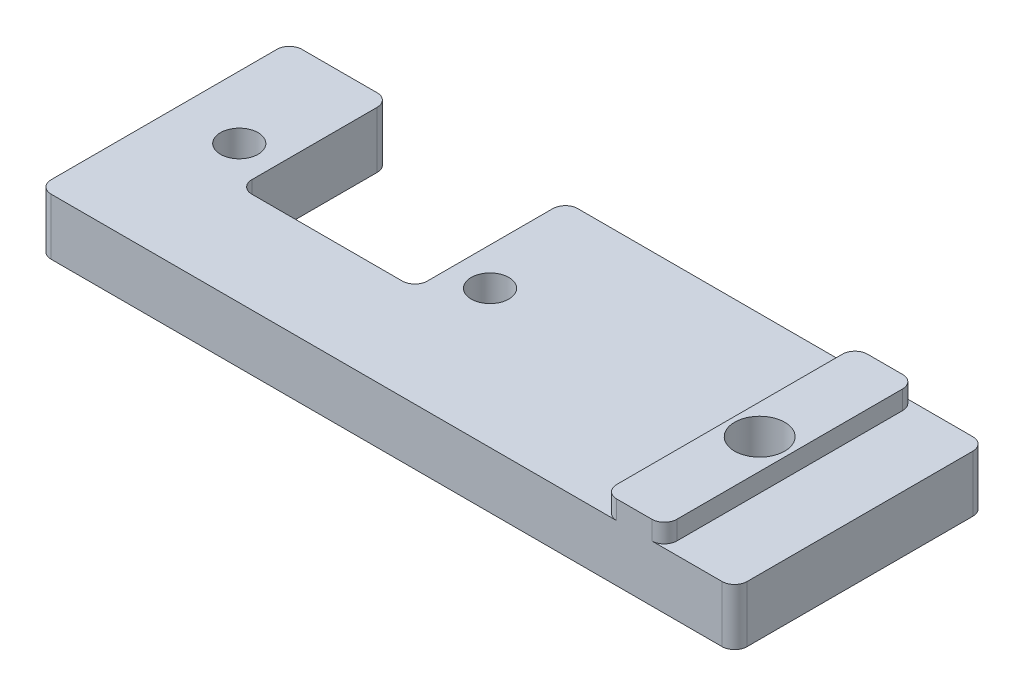
ISO-10303-21;
HEADER;
FILE_DESCRIPTION(('STEP AP214'),'2;1');
FILE_NAME('part.step','',(''),(''),'','','');
FILE_SCHEMA(('AUTOMOTIVE_DESIGN { 1 0 10303 214 1 1 1 1 }'));
ENDSEC;
DATA;
#1=APPLICATION_CONTEXT('core data for automotive mechanical design processes');
#2=APPLICATION_PROTOCOL_DEFINITION('international standard','automotive_design',2000,#1);
#3=PRODUCT_CONTEXT('',#1,'mechanical');
#4=PRODUCT('Part','Part','',(#3));
#5=PRODUCT_RELATED_PRODUCT_CATEGORY('part','',(#4));
#6=PRODUCT_DEFINITION_FORMATION('','',#4);
#7=PRODUCT_DEFINITION_CONTEXT('part definition',#1,'design');
#8=PRODUCT_DEFINITION('design','',#6,#7);
#9=PRODUCT_DEFINITION_SHAPE('','',#8);
#10=(LENGTH_UNIT() NAMED_UNIT(*) SI_UNIT(.MILLI.,.METRE.));
#11=(NAMED_UNIT(*) PLANE_ANGLE_UNIT() SI_UNIT($,.RADIAN.));
#12=(NAMED_UNIT(*) SI_UNIT($,.STERADIAN.) SOLID_ANGLE_UNIT());
#13=UNCERTAINTY_MEASURE_WITH_UNIT(LENGTH_MEASURE(1.E-05),#10,'distance_accuracy_value','');
#14=(GEOMETRIC_REPRESENTATION_CONTEXT(3) GLOBAL_UNCERTAINTY_ASSIGNED_CONTEXT((#13)) GLOBAL_UNIT_ASSIGNED_CONTEXT((#10,
#11,#12)) REPRESENTATION_CONTEXT('',''));
#15=CARTESIAN_POINT('',(0.,0.,0.));
#16=DIRECTION('',(0.,0.,1.));
#17=DIRECTION('',(1.,0.,0.));
#18=AXIS2_PLACEMENT_3D('',#15,#16,#17);
#19=CARTESIAN_POINT('',(0.,0.,0.));
#20=DIRECTION('',(0.,1.,0.));
#21=DIRECTION('',(0.,0.,-1.));
#22=AXIS2_PLACEMENT_3D('',#19,#20,#21);
#23=PLANE('',#22);
#24=CARTESIAN_POINT('',(-10.,0.,0.));
#25=DIRECTION('',(0.,1.,0.));
#26=DIRECTION('',(0.,0.,-1.));
#27=AXIS2_PLACEMENT_3D('',#24,#25,#26);
#28=CIRCLE('',#27,1.5);
#29=CARTESIAN_POINT('',(-10.,0.,-1.5));
#30=VERTEX_POINT('',#29);
#31=EDGE_CURVE('E302',#30,#30,#28,.T.);
#32=ORIENTED_EDGE('',*,*,#31,.T.);
#33=EDGE_LOOP('',(#32));
#34=FACE_BOUND('',#33,.T.);
#35=CARTESIAN_POINT('',(10.,0.,0.));
#36=DIRECTION('',(0.,-1.,0.));
#37=DIRECTION('',(0.,0.,-1.));
#38=AXIS2_PLACEMENT_3D('',#35,#36,#37);
#39=CIRCLE('',#38,1.5);
#40=CARTESIAN_POINT('',(10.,0.,-1.5));
#41=VERTEX_POINT('',#40);
#42=EDGE_CURVE('E357',#41,#41,#39,.T.);
#43=ORIENTED_EDGE('',*,*,#42,.F.);
#44=EDGE_LOOP('',(#43));
#45=FACE_BOUND('',#44,.T.);
#46=DIRECTION('',(-1.,0.,0.));
#47=VECTOR('',#46,1.);
#48=CARTESIAN_POINT('',(15.,0.,11.));
#49=LINE('',#48,#47);
#50=CARTESIAN_POINT('',(39.5,0.,11.));
#51=VERTEX_POINT('',#50);
#52=CARTESIAN_POINT('',(-14.,0.,11.));
#53=VERTEX_POINT('',#52);
#54=EDGE_CURVE('E202',#51,#53,#49,.T.);
#55=ORIENTED_EDGE('',*,*,#54,.T.);
#56=CARTESIAN_POINT('',(-14.,0.,10.));
#57=DIRECTION('',(0.,1.,0.));
#58=DIRECTION('',(0.,0.,-1.));
#59=AXIS2_PLACEMENT_3D('',#56,#57,#58);
#60=CIRCLE('',#59,1.);
#61=CARTESIAN_POINT('',(-15.,0.,10.));
#62=VERTEX_POINT('',#61);
#63=EDGE_CURVE('E212',#53,#62,#60,.F.);
#64=ORIENTED_EDGE('',*,*,#63,.T.);
#65=DIRECTION('',(0.,0.,1.));
#66=VECTOR('',#65,1.);
#67=CARTESIAN_POINT('',(-15.,0.,-9.));
#68=LINE('',#67,#66);
#69=CARTESIAN_POINT('',(-15.,0.,-8.));
#70=VERTEX_POINT('',#69);
#71=EDGE_CURVE('E316',#70,#62,#68,.T.);
#72=ORIENTED_EDGE('',*,*,#71,.F.);
#73=CARTESIAN_POINT('',(-14.,0.,-8.));
#74=DIRECTION('',(0.,1.,0.));
#75=DIRECTION('',(0.,0.,-1.));
#76=AXIS2_PLACEMENT_3D('',#73,#74,#75);
#77=CIRCLE('',#76,1.);
#78=CARTESIAN_POINT('',(-14.,0.,-9.));
#79=VERTEX_POINT('',#78);
#80=EDGE_CURVE('E219',#70,#79,#77,.F.);
#81=ORIENTED_EDGE('',*,*,#80,.T.);
#82=DIRECTION('',(-1.,0.,0.));
#83=VECTOR('',#82,1.);
#84=CARTESIAN_POINT('',(-7.,0.,-9.));
#85=LINE('',#84,#83);
#86=CARTESIAN_POINT('',(-8.,0.,-9.));
#87=VERTEX_POINT('',#86);
#88=EDGE_CURVE('E323',#87,#79,#85,.T.);
#89=ORIENTED_EDGE('',*,*,#88,.F.);
#90=CARTESIAN_POINT('',(-8.,0.,-8.));
#91=DIRECTION('',(0.,1.,0.));
#92=DIRECTION('',(0.,0.,-1.));
#93=AXIS2_PLACEMENT_3D('',#90,#91,#92);
#94=CIRCLE('',#93,1.);
#95=CARTESIAN_POINT('',(-7.,0.,-8.));
#96=VERTEX_POINT('',#95);
#97=EDGE_CURVE('E208',#87,#96,#94,.F.);
#98=ORIENTED_EDGE('',*,*,#97,.T.);
#99=DIRECTION('',(0.,0.,-1.));
#100=VECTOR('',#99,1.);
#101=CARTESIAN_POINT('',(-7.,0.,-9.));
#102=LINE('',#101,#100);
#103=CARTESIAN_POINT('',(-7.,0.,2.));
#104=VERTEX_POINT('',#103);
#105=EDGE_CURVE('E309',#104,#96,#102,.T.);
#106=ORIENTED_EDGE('',*,*,#105,.F.);
#107=CARTESIAN_POINT('',(-6.,0.,2.));
#108=DIRECTION('',(0.,1.,0.));
#109=DIRECTION('',(0.,0.,-1.));
#110=AXIS2_PLACEMENT_3D('',#107,#108,#109);
#111=CIRCLE('',#110,1.);
#112=CARTESIAN_POINT('',(-6.,0.,3.));
#113=VERTEX_POINT('',#112);
#114=EDGE_CURVE('E351',#104,#113,#111,.T.);
#115=ORIENTED_EDGE('',*,*,#114,.T.);
#116=DIRECTION('',(1.,0.,0.));
#117=VECTOR('',#116,1.);
#118=CARTESIAN_POINT('',(7.,0.,3.));
#119=LINE('',#118,#117);
#120=CARTESIAN_POINT('',(6.,0.,3.));
#121=VERTEX_POINT('',#120);
#122=EDGE_CURVE('E225',#113,#121,#119,.T.);
#123=ORIENTED_EDGE('',*,*,#122,.T.);
#124=CARTESIAN_POINT('',(6.,0.,2.));
#125=DIRECTION('',(0.,-1.,0.));
#126=DIRECTION('',(0.,0.,-1.));
#127=AXIS2_PLACEMENT_3D('',#124,#125,#126);
#128=CIRCLE('',#127,1.);
#129=CARTESIAN_POINT('',(7.,0.,2.));
#130=VERTEX_POINT('',#129);
#131=EDGE_CURVE('E251',#130,#121,#128,.T.);
#132=ORIENTED_EDGE('',*,*,#131,.F.);
#133=DIRECTION('',(0.,0.,-1.));
#134=VECTOR('',#133,1.);
#135=CARTESIAN_POINT('',(7.,0.,-9.));
#136=LINE('',#135,#134);
#137=CARTESIAN_POINT('',(7.,0.,-8.));
#138=VERTEX_POINT('',#137);
#139=EDGE_CURVE('E232',#130,#138,#136,.T.);
#140=ORIENTED_EDGE('',*,*,#139,.T.);
#141=CARTESIAN_POINT('',(8.,0.,-8.));
#142=DIRECTION('',(0.,-1.,0.));
#143=DIRECTION('',(0.,0.,-1.));
#144=AXIS2_PLACEMENT_3D('',#141,#142,#143);
#145=CIRCLE('',#144,1.);
#146=CARTESIAN_POINT('',(8.,0.,-9.));
#147=VERTEX_POINT('',#146);
#148=EDGE_CURVE('E236',#147,#138,#145,.F.);
#149=ORIENTED_EDGE('',*,*,#148,.F.);
#150=DIRECTION('',(1.,0.,0.));
#151=VECTOR('',#150,1.);
#152=CARTESIAN_POINT('',(7.,0.,-9.));
#153=LINE('',#152,#151);
#154=CARTESIAN_POINT('',(39.5,0.,-9.));
#155=VERTEX_POINT('',#154);
#156=EDGE_CURVE('E226',#147,#155,#153,.T.);
#157=ORIENTED_EDGE('',*,*,#156,.T.);
#158=CARTESIAN_POINT('',(39.5,0.,-8.));
#159=DIRECTION('',(0.,-1.,0.));
#160=DIRECTION('',(0.,0.,-1.));
#161=AXIS2_PLACEMENT_3D('',#158,#159,#160);
#162=CIRCLE('',#161,1.);
#163=CARTESIAN_POINT('',(40.5,0.,-8.));
#164=VERTEX_POINT('',#163);
#165=EDGE_CURVE('E423',#164,#155,#162,.F.);
#166=ORIENTED_EDGE('',*,*,#165,.F.);
#167=DIRECTION('',(0.,0.,-1.));
#168=VECTOR('',#167,1.);
#169=CARTESIAN_POINT('',(40.5,0.,11.));
#170=LINE('',#169,#168);
#171=CARTESIAN_POINT('',(40.5,0.,10.));
#172=VERTEX_POINT('',#171);
#173=EDGE_CURVE('E300',#172,#164,#170,.T.);
#174=ORIENTED_EDGE('',*,*,#173,.F.);
#175=CARTESIAN_POINT('',(39.5,0.,10.));
#176=DIRECTION('',(0.,-1.,0.));
#177=DIRECTION('',(0.,0.,-1.));
#178=AXIS2_PLACEMENT_3D('',#175,#176,#177);
#179=CIRCLE('',#178,1.);
#180=EDGE_CURVE('E224',#51,#172,#179,.F.);
#181=ORIENTED_EDGE('',*,*,#180,.F.);
#182=EDGE_LOOP('',(#55,#64,#72,#81,#89,#98,#106,#115,#123,#132,#140,#149,#157,#166,#174,#181));
#183=FACE_BOUND('',#182,.T.);
#184=CARTESIAN_POINT('',(32.5,0.,1.));
#185=DIRECTION('',(0.,1.,0.));
#186=DIRECTION('',(0.,0.,1.));
#187=AXIS2_PLACEMENT_3D('',#184,#185,#186);
#188=CIRCLE('',#187,2.);
#189=CARTESIAN_POINT('',(32.5,0.,3.));
#190=VERTEX_POINT('',#189);
#191=EDGE_CURVE('E477',#190,#190,#188,.T.);
#192=ORIENTED_EDGE('',*,*,#191,.T.);
#193=EDGE_LOOP('',(#192));
#194=FACE_BOUND('',#193,.T.);
#195=ADVANCED_FACE('F35',(#34,#45,#183,#194),#23,.F.);
#196=CARTESIAN_POINT('',(0.,4.5,0.));
#197=DIRECTION('',(0.,1.,0.));
#198=DIRECTION('',(0.,0.,-1.));
#199=AXIS2_PLACEMENT_3D('',#196,#197,#198);
#200=PLANE('',#199);
#201=CARTESIAN_POINT('',(-10.,4.5,0.));
#202=DIRECTION('',(0.,1.,0.));
#203=DIRECTION('',(0.,0.,-1.));
#204=AXIS2_PLACEMENT_3D('',#201,#202,#203);
#205=CIRCLE('',#204,1.5);
#206=CARTESIAN_POINT('',(-10.,4.5,-1.5));
#207=VERTEX_POINT('',#206);
#208=EDGE_CURVE('E306',#207,#207,#205,.T.);
#209=ORIENTED_EDGE('',*,*,#208,.F.);
#210=EDGE_LOOP('',(#209));
#211=FACE_BOUND('',#210,.T.);
#212=CARTESIAN_POINT('',(10.,4.5,0.));
#213=DIRECTION('',(0.,-1.,0.));
#214=DIRECTION('',(0.,0.,-1.));
#215=AXIS2_PLACEMENT_3D('',#212,#213,#214);
#216=CIRCLE('',#215,1.5);
#217=CARTESIAN_POINT('',(10.,4.5,-1.5));
#218=VERTEX_POINT('',#217);
#219=EDGE_CURVE('E358',#218,#218,#216,.T.);
#220=ORIENTED_EDGE('',*,*,#219,.T.);
#221=EDGE_LOOP('',(#220));
#222=FACE_BOUND('',#221,.T.);
#223=DIRECTION('',(1.,0.,0.));
#224=VECTOR('',#223,1.);
#225=CARTESIAN_POINT('',(7.,4.5,-9.));
#226=LINE('',#225,#224);
#227=CARTESIAN_POINT('',(8.,4.5,-9.));
#228=VERTEX_POINT('',#227);
#229=CARTESIAN_POINT('',(31.1,4.5,-9.));
#230=VERTEX_POINT('',#229);
#231=EDGE_CURVE('E258',#228,#230,#226,.T.);
#232=ORIENTED_EDGE('',*,*,#231,.F.);
#233=CARTESIAN_POINT('',(8.,4.5,-8.));
#234=DIRECTION('',(0.,-1.,0.));
#235=DIRECTION('',(0.,0.,-1.));
#236=AXIS2_PLACEMENT_3D('',#233,#234,#235);
#237=CIRCLE('',#236,1.);
#238=CARTESIAN_POINT('',(7.,4.5,-8.));
#239=VERTEX_POINT('',#238);
#240=EDGE_CURVE('E239',#239,#228,#237,.T.);
#241=ORIENTED_EDGE('',*,*,#240,.F.);
#242=DIRECTION('',(0.,0.,-1.));
#243=VECTOR('',#242,1.);
#244=CARTESIAN_POINT('',(7.,4.5,-9.));
#245=LINE('',#244,#243);
#246=CARTESIAN_POINT('',(7.,4.5,2.));
#247=VERTEX_POINT('',#246);
#248=EDGE_CURVE('E229',#247,#239,#245,.T.);
#249=ORIENTED_EDGE('',*,*,#248,.F.);
#250=CARTESIAN_POINT('',(6.,4.5,2.));
#251=DIRECTION('',(0.,-1.,0.));
#252=DIRECTION('',(0.,0.,-1.));
#253=AXIS2_PLACEMENT_3D('',#250,#251,#252);
#254=CIRCLE('',#253,1.);
#255=CARTESIAN_POINT('',(6.,4.5,3.));
#256=VERTEX_POINT('',#255);
#257=EDGE_CURVE('E254',#256,#247,#254,.F.);
#258=ORIENTED_EDGE('',*,*,#257,.F.);
#259=DIRECTION('',(1.,0.,0.));
#260=VECTOR('',#259,1.);
#261=CARTESIAN_POINT('',(7.,4.5,3.));
#262=LINE('',#261,#260);
#263=CARTESIAN_POINT('',(-6.,4.5,3.));
#264=VERTEX_POINT('',#263);
#265=EDGE_CURVE('E240',#264,#256,#262,.T.);
#266=ORIENTED_EDGE('',*,*,#265,.F.);
#267=CARTESIAN_POINT('',(-6.,4.5,2.));
#268=DIRECTION('',(0.,1.,0.));
#269=DIRECTION('',(0.,0.,-1.));
#270=AXIS2_PLACEMENT_3D('',#267,#268,#269);
#271=CIRCLE('',#270,1.);
#272=CARTESIAN_POINT('',(-7.,4.5,2.));
#273=VERTEX_POINT('',#272);
#274=EDGE_CURVE('E354',#264,#273,#271,.F.);
#275=ORIENTED_EDGE('',*,*,#274,.T.);
#276=DIRECTION('',(0.,0.,-1.));
#277=VECTOR('',#276,1.);
#278=CARTESIAN_POINT('',(-7.,4.5,-9.));
#279=LINE('',#278,#277);
#280=CARTESIAN_POINT('',(-7.,4.5,-8.));
#281=VERTEX_POINT('',#280);
#282=EDGE_CURVE('E312',#273,#281,#279,.T.);
#283=ORIENTED_EDGE('',*,*,#282,.T.);
#284=CARTESIAN_POINT('',(-8.,4.5,-8.));
#285=DIRECTION('',(0.,1.,0.));
#286=DIRECTION('',(0.,0.,-1.));
#287=AXIS2_PLACEMENT_3D('',#284,#285,#286);
#288=CIRCLE('',#287,1.);
#289=CARTESIAN_POINT('',(-8.,4.5,-9.));
#290=VERTEX_POINT('',#289);
#291=EDGE_CURVE('E333',#281,#290,#288,.T.);
#292=ORIENTED_EDGE('',*,*,#291,.T.);
#293=DIRECTION('',(-1.,0.,0.));
#294=VECTOR('',#293,1.);
#295=CARTESIAN_POINT('',(-7.,4.5,-9.));
#296=LINE('',#295,#294);
#297=CARTESIAN_POINT('',(-14.,4.5,-9.));
#298=VERTEX_POINT('',#297);
#299=EDGE_CURVE('E315',#290,#298,#296,.T.);
#300=ORIENTED_EDGE('',*,*,#299,.T.);
#301=CARTESIAN_POINT('',(-14.,4.5,-8.));
#302=DIRECTION('',(0.,1.,0.));
#303=DIRECTION('',(0.,0.,-1.));
#304=AXIS2_PLACEMENT_3D('',#301,#302,#303);
#305=CIRCLE('',#304,1.);
#306=CARTESIAN_POINT('',(-15.,4.5,-8.));
#307=VERTEX_POINT('',#306);
#308=EDGE_CURVE('E336',#298,#307,#305,.T.);
#309=ORIENTED_EDGE('',*,*,#308,.T.);
#310=DIRECTION('',(0.,0.,1.));
#311=VECTOR('',#310,1.);
#312=CARTESIAN_POINT('',(-15.,4.5,-9.));
#313=LINE('',#312,#311);
#314=CARTESIAN_POINT('',(-15.,4.5,10.));
#315=VERTEX_POINT('',#314);
#316=EDGE_CURVE('E209',#307,#315,#313,.T.);
#317=ORIENTED_EDGE('',*,*,#316,.T.);
#318=CARTESIAN_POINT('',(-14.,4.5,10.));
#319=DIRECTION('',(0.,1.,0.));
#320=DIRECTION('',(0.,0.,-1.));
#321=AXIS2_PLACEMENT_3D('',#318,#319,#320);
#322=CIRCLE('',#321,1.);
#323=CARTESIAN_POINT('',(-14.,4.5,11.));
#324=VERTEX_POINT('',#323);
#325=EDGE_CURVE('E339',#315,#324,#322,.T.);
#326=ORIENTED_EDGE('',*,*,#325,.T.);
#327=DIRECTION('',(-1.,0.,0.));
#328=VECTOR('',#327,1.);
#329=CARTESIAN_POINT('',(15.,4.5,11.));
#330=LINE('',#329,#328);
#331=CARTESIAN_POINT('',(31.1,4.5,11.));
#332=VERTEX_POINT('',#331);
#333=EDGE_CURVE('E204',#332,#324,#330,.T.);
#334=ORIENTED_EDGE('',*,*,#333,.F.);
#335=CARTESIAN_POINT('',(31.1,4.5,10.));
#336=DIRECTION('',(0.,-1.,0.));
#337=DIRECTION('',(0.,0.,-1.));
#338=AXIS2_PLACEMENT_3D('',#335,#336,#337);
#339=CIRCLE('',#338,1.);
#340=CARTESIAN_POINT('',(30.1,4.5,10.));
#341=VERTEX_POINT('',#340);
#342=EDGE_CURVE('E440',#341,#332,#339,.F.);
#343=ORIENTED_EDGE('',*,*,#342,.F.);
#344=DIRECTION('',(0.,0.,1.));
#345=VECTOR('',#344,1.);
#346=CARTESIAN_POINT('',(30.1,4.5,-9.));
#347=LINE('',#346,#345);
#348=CARTESIAN_POINT('',(30.1,4.5,-8.));
#349=VERTEX_POINT('',#348);
#350=EDGE_CURVE('E293',#349,#341,#347,.T.);
#351=ORIENTED_EDGE('',*,*,#350,.F.);
#352=CARTESIAN_POINT('',(31.1,4.5,-8.));
#353=DIRECTION('',(0.,-1.,0.));
#354=DIRECTION('',(0.,0.,-1.));
#355=AXIS2_PLACEMENT_3D('',#352,#353,#354);
#356=CIRCLE('',#355,1.);
#357=EDGE_CURVE('E422',#230,#349,#356,.F.);
#358=ORIENTED_EDGE('',*,*,#357,.F.);
#359=EDGE_LOOP('',(#232,#241,#249,#258,#266,#275,#283,#292,#300,#309,#317,#326,#334,#343,#351,#358));
#360=FACE_BOUND('',#359,.T.);
#361=ADVANCED_FACE('F366',(#211,#222,#360),#200,.T.);
#362=DIRECTION('',(0.,0.,1.));
#363=VECTOR('',#362,1.);
#364=CARTESIAN_POINT('',(40.5,4.5,11.));
#365=LINE('',#364,#363);
#366=CARTESIAN_POINT('',(40.5,4.5,-8.));
#367=VERTEX_POINT('',#366);
#368=CARTESIAN_POINT('',(40.5,4.5,10.));
#369=VERTEX_POINT('',#368);
#370=EDGE_CURVE('E303',#367,#369,#365,.T.);
#371=ORIENTED_EDGE('',*,*,#370,.F.);
#372=CARTESIAN_POINT('',(39.5,4.5,-8.));
#373=DIRECTION('',(0.,-1.,0.));
#374=DIRECTION('',(0.,0.,-1.));
#375=AXIS2_PLACEMENT_3D('',#372,#373,#374);
#376=CIRCLE('',#375,1.);
#377=CARTESIAN_POINT('',(39.5,4.5,-9.));
#378=VERTEX_POINT('',#377);
#379=EDGE_CURVE('E429',#378,#367,#376,.T.);
#380=ORIENTED_EDGE('',*,*,#379,.F.);
#381=CARTESIAN_POINT('',(33.9,4.5,-9.));
#382=VERTEX_POINT('',#381);
#383=EDGE_CURVE('E262',#382,#378,#226,.T.);
#384=ORIENTED_EDGE('',*,*,#383,.F.);
#385=CARTESIAN_POINT('',(33.9,4.5,-8.));
#386=DIRECTION('',(0.,-1.,0.));
#387=DIRECTION('',(0.,0.,-1.));
#388=AXIS2_PLACEMENT_3D('',#385,#386,#387);
#389=CIRCLE('',#388,1.);
#390=CARTESIAN_POINT('',(34.9,4.5,-8.));
#391=VERTEX_POINT('',#390);
#392=EDGE_CURVE('E11',#391,#382,#389,.F.);
#393=ORIENTED_EDGE('',*,*,#392,.F.);
#394=DIRECTION('',(0.,0.,-1.));
#395=VECTOR('',#394,1.);
#396=CARTESIAN_POINT('',(34.9,4.5,-9.));
#397=LINE('',#396,#395);
#398=CARTESIAN_POINT('',(34.9,4.5,10.));
#399=VERTEX_POINT('',#398);
#400=EDGE_CURVE('E288',#399,#391,#397,.T.);
#401=ORIENTED_EDGE('',*,*,#400,.F.);
#402=CARTESIAN_POINT('',(33.9,4.5,10.));
#403=DIRECTION('',(0.,-1.,0.));
#404=DIRECTION('',(0.,0.,-1.));
#405=AXIS2_PLACEMENT_3D('',#402,#403,#404);
#406=CIRCLE('',#405,1.);
#407=CARTESIAN_POINT('',(33.9,4.5,11.));
#408=VERTEX_POINT('',#407);
#409=EDGE_CURVE('E43',#408,#399,#406,.F.);
#410=ORIENTED_EDGE('',*,*,#409,.F.);
#411=CARTESIAN_POINT('',(39.5,4.5,11.));
#412=VERTEX_POINT('',#411);
#413=EDGE_CURVE('E274',#412,#408,#330,.T.);
#414=ORIENTED_EDGE('',*,*,#413,.F.);
#415=CARTESIAN_POINT('',(39.5,4.5,10.));
#416=DIRECTION('',(0.,-1.,0.));
#417=DIRECTION('',(0.,0.,-1.));
#418=AXIS2_PLACEMENT_3D('',#415,#416,#417);
#419=CIRCLE('',#418,1.);
#420=EDGE_CURVE('E431',#369,#412,#419,.T.);
#421=ORIENTED_EDGE('',*,*,#420,.F.);
#422=EDGE_LOOP('',(#371,#380,#384,#393,#401,#410,#414,#421));
#423=FACE_BOUND('',#422,.T.);
#424=ADVANCED_FACE('F372',(#423),#200,.T.);
#425=CARTESIAN_POINT('',(7.,4.5,-9.));
#426=DIRECTION('',(1.,0.,0.));
#427=DIRECTION('',(0.,0.,1.));
#428=AXIS2_PLACEMENT_3D('',#425,#426,#427);
#429=PLANE('',#428);
#430=ORIENTED_EDGE('',*,*,#139,.F.);
#431=DIRECTION('',(0.,-1.,0.));
#432=VECTOR('',#431,1.);
#433=CARTESIAN_POINT('',(7.,0.,2.));
#434=LINE('',#433,#432);
#435=EDGE_CURVE('E245',#247,#130,#434,.T.);
#436=ORIENTED_EDGE('',*,*,#435,.F.);
#437=ORIENTED_EDGE('',*,*,#248,.T.);
#438=DIRECTION('',(0.,-1.,0.));
#439=VECTOR('',#438,1.);
#440=CARTESIAN_POINT('',(7.,4.5,-8.));
#441=LINE('',#440,#439);
#442=EDGE_CURVE('E247',#138,#239,#441,.F.);
#443=ORIENTED_EDGE('',*,*,#442,.F.);
#444=EDGE_LOOP('',(#430,#436,#437,#443));
#445=FACE_BOUND('',#444,.T.);
#446=ADVANCED_FACE('F386',(#445),#429,.F.);
#447=CARTESIAN_POINT('',(7.,4.5,-9.));
#448=DIRECTION('',(0.,0.,1.));
#449=DIRECTION('',(-1.,0.,0.));
#450=AXIS2_PLACEMENT_3D('',#447,#448,#449);
#451=PLANE('',#450);
#452=DIRECTION('',(-1.,0.,0.));
#453=VECTOR('',#452,1.);
#454=CARTESIAN_POINT('',(30.1,6.,-9.));
#455=LINE('',#454,#453);
#456=CARTESIAN_POINT('',(33.9,6.,-9.));
#457=VERTEX_POINT('',#456);
#458=CARTESIAN_POINT('',(31.1,6.,-9.));
#459=VERTEX_POINT('',#458);
#460=EDGE_CURVE('E305',#457,#459,#455,.T.);
#461=ORIENTED_EDGE('',*,*,#460,.F.);
#462=DIRECTION('',(0.,-1.,0.));
#463=VECTOR('',#462,1.);
#464=CARTESIAN_POINT('',(33.9,6.,-9.));
#465=LINE('',#464,#463);
#466=EDGE_CURVE('E459',#382,#457,#465,.F.);
#467=ORIENTED_EDGE('',*,*,#466,.F.);
#468=ORIENTED_EDGE('',*,*,#383,.T.);
#469=DIRECTION('',(0.,1.,0.));
#470=VECTOR('',#469,1.);
#471=CARTESIAN_POINT('',(39.5,4.5,-9.));
#472=LINE('',#471,#470);
#473=EDGE_CURVE('E257',#155,#378,#472,.T.);
#474=ORIENTED_EDGE('',*,*,#473,.F.);
#475=ORIENTED_EDGE('',*,*,#156,.F.);
#476=DIRECTION('',(0.,-1.,0.));
#477=VECTOR('',#476,1.);
#478=CARTESIAN_POINT('',(8.,4.5,-9.));
#479=LINE('',#478,#477);
#480=EDGE_CURVE('E243',#228,#147,#479,.T.);
#481=ORIENTED_EDGE('',*,*,#480,.F.);
#482=ORIENTED_EDGE('',*,*,#231,.T.);
#483=DIRECTION('',(0.,-1.,0.));
#484=VECTOR('',#483,1.);
#485=CARTESIAN_POINT('',(31.1,4.5,-9.));
#486=LINE('',#485,#484);
#487=EDGE_CURVE('E539',#459,#230,#486,.T.);
#488=ORIENTED_EDGE('',*,*,#487,.F.);
#489=EDGE_LOOP('',(#461,#467,#468,#474,#475,#481,#482,#488));
#490=FACE_BOUND('',#489,.T.);
#491=ADVANCED_FACE('F383',(#490),#451,.F.);
#492=CARTESIAN_POINT('',(15.,4.5,11.));
#493=DIRECTION('',(0.,0.,-1.));
#494=DIRECTION('',(1.,0.,0.));
#495=AXIS2_PLACEMENT_3D('',#492,#493,#494);
#496=PLANE('',#495);
#497=ORIENTED_EDGE('',*,*,#333,.T.);
#498=DIRECTION('',(0.,-1.,0.));
#499=VECTOR('',#498,1.);
#500=CARTESIAN_POINT('',(-14.,4.5,11.));
#501=LINE('',#500,#499);
#502=EDGE_CURVE('E198',#324,#53,#501,.T.);
#503=ORIENTED_EDGE('',*,*,#502,.T.);
#504=ORIENTED_EDGE('',*,*,#54,.F.);
#505=DIRECTION('',(0.,1.,0.));
#506=VECTOR('',#505,1.);
#507=CARTESIAN_POINT('',(39.5,0.,11.));
#508=LINE('',#507,#506);
#509=EDGE_CURVE('E280',#412,#51,#508,.F.);
#510=ORIENTED_EDGE('',*,*,#509,.F.);
#511=ORIENTED_EDGE('',*,*,#413,.T.);
#512=DIRECTION('',(0.,-1.,0.));
#513=VECTOR('',#512,1.);
#514=CARTESIAN_POINT('',(33.9,4.5,11.));
#515=LINE('',#514,#513);
#516=CARTESIAN_POINT('',(33.9,6.,11.));
#517=VERTEX_POINT('',#516);
#518=EDGE_CURVE('E282',#517,#408,#515,.T.);
#519=ORIENTED_EDGE('',*,*,#518,.F.);
#520=DIRECTION('',(1.,0.,0.));
#521=VECTOR('',#520,1.);
#522=CARTESIAN_POINT('',(30.1,6.,11.));
#523=LINE('',#522,#521);
#524=CARTESIAN_POINT('',(31.1,6.,11.));
#525=VERTEX_POINT('',#524);
#526=EDGE_CURVE('E469',#525,#517,#523,.T.);
#527=ORIENTED_EDGE('',*,*,#526,.F.);
#528=DIRECTION('',(0.,-1.,0.));
#529=VECTOR('',#528,1.);
#530=CARTESIAN_POINT('',(31.1,6.,11.));
#531=LINE('',#530,#529);
#532=EDGE_CURVE('E284',#332,#525,#531,.F.);
#533=ORIENTED_EDGE('',*,*,#532,.F.);
#534=EDGE_LOOP('',(#497,#503,#504,#510,#511,#519,#527,#533));
#535=FACE_BOUND('',#534,.T.);
#536=ADVANCED_FACE('F200',(#535),#496,.F.);
#537=CARTESIAN_POINT('',(7.,4.5,3.));
#538=DIRECTION('',(0.,0.,1.));
#539=DIRECTION('',(-1.,0.,0.));
#540=AXIS2_PLACEMENT_3D('',#537,#538,#539);
#541=PLANE('',#540);
#542=ORIENTED_EDGE('',*,*,#122,.F.);
#543=DIRECTION('',(0.,-1.,0.));
#544=VECTOR('',#543,1.);
#545=CARTESIAN_POINT('',(-6.,4.5,3.));
#546=LINE('',#545,#544);
#547=EDGE_CURVE('E349',#113,#264,#546,.F.);
#548=ORIENTED_EDGE('',*,*,#547,.T.);
#549=ORIENTED_EDGE('',*,*,#265,.T.);
#550=DIRECTION('',(0.,-1.,0.));
#551=VECTOR('',#550,1.);
#552=CARTESIAN_POINT('',(6.,4.5,3.));
#553=LINE('',#552,#551);
#554=EDGE_CURVE('E249',#121,#256,#553,.F.);
#555=ORIENTED_EDGE('',*,*,#554,.F.);
#556=EDGE_LOOP('',(#542,#548,#549,#555));
#557=FACE_BOUND('',#556,.T.);
#558=ADVANCED_FACE('F377',(#557),#541,.F.);
#559=CARTESIAN_POINT('',(10.,4.5,0.));
#560=DIRECTION('',(0.,-1.,0.));
#561=DIRECTION('',(0.,0.,1.));
#562=AXIS2_PLACEMENT_3D('',#559,#560,#561);
#563=CYLINDRICAL_SURFACE('',#562,1.5);
#564=ORIENTED_EDGE('',*,*,#219,.F.);
#565=EDGE_LOOP('',(#564));
#566=FACE_BOUND('',#565,.T.);
#567=ORIENTED_EDGE('',*,*,#42,.T.);
#568=EDGE_LOOP('',(#567));
#569=FACE_BOUND('',#568,.T.);
#570=ADVANCED_FACE('F363',(#566,#569),#563,.F.);
#571=CARTESIAN_POINT('',(8.,4.5,-8.));
#572=DIRECTION('',(0.,-1.,0.));
#573=DIRECTION('',(0.,0.,1.));
#574=AXIS2_PLACEMENT_3D('',#571,#572,#573);
#575=CYLINDRICAL_SURFACE('',#574,1.);
#576=ORIENTED_EDGE('',*,*,#240,.T.);
#577=ORIENTED_EDGE('',*,*,#480,.T.);
#578=ORIENTED_EDGE('',*,*,#148,.T.);
#579=ORIENTED_EDGE('',*,*,#442,.T.);
#580=EDGE_LOOP('',(#576,#577,#578,#579));
#581=FACE_BOUND('',#580,.T.);
#582=ADVANCED_FACE('F391',(#581),#575,.T.);
#583=CARTESIAN_POINT('',(6.,4.5,2.));
#584=DIRECTION('',(0.,1.,0.));
#585=DIRECTION('',(0.,0.,-1.));
#586=AXIS2_PLACEMENT_3D('',#583,#584,#585);
#587=CYLINDRICAL_SURFACE('',#586,1.);
#588=ORIENTED_EDGE('',*,*,#257,.T.);
#589=ORIENTED_EDGE('',*,*,#435,.T.);
#590=ORIENTED_EDGE('',*,*,#131,.T.);
#591=ORIENTED_EDGE('',*,*,#554,.T.);
#592=EDGE_LOOP('',(#588,#589,#590,#591));
#593=FACE_BOUND('',#592,.T.);
#594=ADVANCED_FACE('F394',(#593),#587,.F.);
#595=CARTESIAN_POINT('',(-7.,4.5,-9.));
#596=DIRECTION('',(-1.,0.,0.));
#597=DIRECTION('',(0.,0.,1.));
#598=AXIS2_PLACEMENT_3D('',#595,#596,#597);
#599=PLANE('',#598);
#600=ORIENTED_EDGE('',*,*,#105,.T.);
#601=DIRECTION('',(0.,-1.,0.));
#602=VECTOR('',#601,1.);
#603=CARTESIAN_POINT('',(-7.,4.5,-8.));
#604=LINE('',#603,#602);
#605=EDGE_CURVE('E347',#96,#281,#604,.F.);
#606=ORIENTED_EDGE('',*,*,#605,.T.);
#607=ORIENTED_EDGE('',*,*,#282,.F.);
#608=DIRECTION('',(0.,-1.,0.));
#609=VECTOR('',#608,1.);
#610=CARTESIAN_POINT('',(-7.,0.,2.));
#611=LINE('',#610,#609);
#612=EDGE_CURVE('E345',#273,#104,#611,.T.);
#613=ORIENTED_EDGE('',*,*,#612,.T.);
#614=EDGE_LOOP('',(#600,#606,#607,#613));
#615=FACE_BOUND('',#614,.T.);
#616=ADVANCED_FACE('F398',(#615),#599,.F.);
#617=CARTESIAN_POINT('',(-7.,4.5,-9.));
#618=DIRECTION('',(0.,0.,1.));
#619=DIRECTION('',(1.,0.,0.));
#620=AXIS2_PLACEMENT_3D('',#617,#618,#619);
#621=PLANE('',#620);
#622=ORIENTED_EDGE('',*,*,#88,.T.);
#623=DIRECTION('',(0.,-1.,0.));
#624=VECTOR('',#623,1.);
#625=CARTESIAN_POINT('',(-14.,4.5,-9.));
#626=LINE('',#625,#624);
#627=EDGE_CURVE('E343',#79,#298,#626,.F.);
#628=ORIENTED_EDGE('',*,*,#627,.T.);
#629=ORIENTED_EDGE('',*,*,#299,.F.);
#630=DIRECTION('',(0.,-1.,0.));
#631=VECTOR('',#630,1.);
#632=CARTESIAN_POINT('',(-8.,4.5,-9.));
#633=LINE('',#632,#631);
#634=EDGE_CURVE('E341',#290,#87,#633,.T.);
#635=ORIENTED_EDGE('',*,*,#634,.T.);
#636=EDGE_LOOP('',(#622,#628,#629,#635));
#637=FACE_BOUND('',#636,.T.);
#638=ADVANCED_FACE('F506',(#637),#621,.F.);
#639=CARTESIAN_POINT('',(-15.,4.5,-9.));
#640=DIRECTION('',(1.,0.,0.));
#641=DIRECTION('',(0.,0.,-1.));
#642=AXIS2_PLACEMENT_3D('',#639,#640,#641);
#643=PLANE('',#642);
#644=ORIENTED_EDGE('',*,*,#71,.T.);
#645=DIRECTION('',(0.,-1.,0.));
#646=VECTOR('',#645,1.);
#647=CARTESIAN_POINT('',(-15.,4.5,10.));
#648=LINE('',#647,#646);
#649=EDGE_CURVE('E214',#62,#315,#648,.F.);
#650=ORIENTED_EDGE('',*,*,#649,.T.);
#651=ORIENTED_EDGE('',*,*,#316,.F.);
#652=DIRECTION('',(0.,-1.,0.));
#653=VECTOR('',#652,1.);
#654=CARTESIAN_POINT('',(-15.,4.5,-8.));
#655=LINE('',#654,#653);
#656=EDGE_CURVE('E218',#307,#70,#655,.T.);
#657=ORIENTED_EDGE('',*,*,#656,.T.);
#658=EDGE_LOOP('',(#644,#650,#651,#657));
#659=FACE_BOUND('',#658,.T.);
#660=ADVANCED_FACE('F502',(#659),#643,.F.);
#661=CARTESIAN_POINT('',(-10.,4.5,0.));
#662=DIRECTION('',(0.,-1.,0.));
#663=DIRECTION('',(0.,0.,1.));
#664=AXIS2_PLACEMENT_3D('',#661,#662,#663);
#665=CYLINDRICAL_SURFACE('',#664,1.5);
#666=ORIENTED_EDGE('',*,*,#208,.T.);
#667=EDGE_LOOP('',(#666));
#668=FACE_BOUND('',#667,.T.);
#669=ORIENTED_EDGE('',*,*,#31,.F.);
#670=EDGE_LOOP('',(#669));
#671=FACE_BOUND('',#670,.T.);
#672=ADVANCED_FACE('F499',(#668,#671),#665,.F.);
#673=CARTESIAN_POINT('',(-14.,4.5,10.));
#674=DIRECTION('',(0.,-1.,0.));
#675=DIRECTION('',(0.,0.,1.));
#676=AXIS2_PLACEMENT_3D('',#673,#674,#675);
#677=CYLINDRICAL_SURFACE('',#676,1.);
#678=ORIENTED_EDGE('',*,*,#325,.F.);
#679=ORIENTED_EDGE('',*,*,#649,.F.);
#680=ORIENTED_EDGE('',*,*,#63,.F.);
#681=ORIENTED_EDGE('',*,*,#502,.F.);
#682=EDGE_LOOP('',(#678,#679,#680,#681));
#683=FACE_BOUND('',#682,.T.);
#684=ADVANCED_FACE('F213',(#683),#677,.T.);
#685=CARTESIAN_POINT('',(-14.,4.5,-8.));
#686=DIRECTION('',(0.,-1.,0.));
#687=DIRECTION('',(0.,0.,1.));
#688=AXIS2_PLACEMENT_3D('',#685,#686,#687);
#689=CYLINDRICAL_SURFACE('',#688,1.);
#690=ORIENTED_EDGE('',*,*,#308,.F.);
#691=ORIENTED_EDGE('',*,*,#627,.F.);
#692=ORIENTED_EDGE('',*,*,#80,.F.);
#693=ORIENTED_EDGE('',*,*,#656,.F.);
#694=EDGE_LOOP('',(#690,#691,#692,#693));
#695=FACE_BOUND('',#694,.T.);
#696=ADVANCED_FACE('F516',(#695),#689,.T.);
#697=CARTESIAN_POINT('',(-8.,4.5,-8.));
#698=DIRECTION('',(0.,-1.,0.));
#699=DIRECTION('',(0.,0.,1.));
#700=AXIS2_PLACEMENT_3D('',#697,#698,#699);
#701=CYLINDRICAL_SURFACE('',#700,1.);
#702=ORIENTED_EDGE('',*,*,#291,.F.);
#703=ORIENTED_EDGE('',*,*,#605,.F.);
#704=ORIENTED_EDGE('',*,*,#97,.F.);
#705=ORIENTED_EDGE('',*,*,#634,.F.);
#706=EDGE_LOOP('',(#702,#703,#704,#705));
#707=FACE_BOUND('',#706,.T.);
#708=ADVANCED_FACE('F519',(#707),#701,.T.);
#709=CARTESIAN_POINT('',(-6.,4.5,2.));
#710=DIRECTION('',(0.,1.,0.));
#711=DIRECTION('',(0.,0.,-1.));
#712=AXIS2_PLACEMENT_3D('',#709,#710,#711);
#713=CYLINDRICAL_SURFACE('',#712,1.);
#714=ORIENTED_EDGE('',*,*,#274,.F.);
#715=ORIENTED_EDGE('',*,*,#547,.F.);
#716=ORIENTED_EDGE('',*,*,#114,.F.);
#717=ORIENTED_EDGE('',*,*,#612,.F.);
#718=EDGE_LOOP('',(#714,#715,#716,#717));
#719=FACE_BOUND('',#718,.T.);
#720=ADVANCED_FACE('F498',(#719),#713,.F.);
#721=CARTESIAN_POINT('',(40.5,-33.2001506020681,11.));
#722=DIRECTION('',(1.,0.,0.));
#723=DIRECTION('',(0.,0.,1.));
#724=AXIS2_PLACEMENT_3D('',#721,#722,#723);
#725=PLANE('',#724);
#726=ORIENTED_EDGE('',*,*,#173,.T.);
#727=DIRECTION('',(0.,1.,0.));
#728=VECTOR('',#727,1.);
#729=CARTESIAN_POINT('',(40.5,0.,-8.));
#730=LINE('',#729,#728);
#731=EDGE_CURVE('E58',#367,#164,#730,.F.);
#732=ORIENTED_EDGE('',*,*,#731,.F.);
#733=ORIENTED_EDGE('',*,*,#370,.T.);
#734=DIRECTION('',(0.,1.,0.));
#735=VECTOR('',#734,1.);
#736=CARTESIAN_POINT('',(40.5,4.5,10.));
#737=LINE('',#736,#735);
#738=EDGE_CURVE('E50',#172,#369,#737,.T.);
#739=ORIENTED_EDGE('',*,*,#738,.F.);
#740=EDGE_LOOP('',(#726,#732,#733,#739));
#741=FACE_BOUND('',#740,.T.);
#742=ADVANCED_FACE('F427',(#741),#725,.T.);
#743=CARTESIAN_POINT('',(30.1,6.,-9.));
#744=DIRECTION('',(-1.,0.,0.));
#745=DIRECTION('',(0.,0.,-1.));
#746=AXIS2_PLACEMENT_3D('',#743,#744,#745);
#747=PLANE('',#746);
#748=ORIENTED_EDGE('',*,*,#350,.T.);
#749=DIRECTION('',(0.,-1.,0.));
#750=VECTOR('',#749,1.);
#751=CARTESIAN_POINT('',(30.1,4.5,10.));
#752=LINE('',#751,#750);
#753=CARTESIAN_POINT('',(30.1,6.,10.));
#754=VERTEX_POINT('',#753);
#755=EDGE_CURVE('E551',#754,#341,#752,.T.);
#756=ORIENTED_EDGE('',*,*,#755,.F.);
#757=DIRECTION('',(0.,0.,1.));
#758=VECTOR('',#757,1.);
#759=CARTESIAN_POINT('',(30.1,6.,-9.));
#760=LINE('',#759,#758);
#761=CARTESIAN_POINT('',(30.1,6.,-8.));
#762=VERTEX_POINT('',#761);
#763=EDGE_CURVE('E292',#762,#754,#760,.T.);
#764=ORIENTED_EDGE('',*,*,#763,.F.);
#765=DIRECTION('',(0.,-1.,0.));
#766=VECTOR('',#765,1.);
#767=CARTESIAN_POINT('',(30.1,6.,-8.));
#768=LINE('',#767,#766);
#769=EDGE_CURVE('E464',#349,#762,#768,.F.);
#770=ORIENTED_EDGE('',*,*,#769,.F.);
#771=EDGE_LOOP('',(#748,#756,#764,#770));
#772=FACE_BOUND('',#771,.T.);
#773=ADVANCED_FACE('F492',(#772),#747,.T.);
#774=CARTESIAN_POINT('',(34.9,6.,-9.));
#775=DIRECTION('',(1.,0.,0.));
#776=DIRECTION('',(0.,0.,1.));
#777=AXIS2_PLACEMENT_3D('',#774,#775,#776);
#778=PLANE('',#777);
#779=ORIENTED_EDGE('',*,*,#400,.T.);
#780=DIRECTION('',(0.,-1.,0.));
#781=VECTOR('',#780,1.);
#782=CARTESIAN_POINT('',(34.9,4.5,-8.));
#783=LINE('',#782,#781);
#784=CARTESIAN_POINT('',(34.9,6.,-8.));
#785=VERTEX_POINT('',#784);
#786=EDGE_CURVE('E287',#785,#391,#783,.T.);
#787=ORIENTED_EDGE('',*,*,#786,.F.);
#788=DIRECTION('',(0.,0.,-1.));
#789=VECTOR('',#788,1.);
#790=CARTESIAN_POINT('',(34.9,6.,-9.));
#791=LINE('',#790,#789);
#792=CARTESIAN_POINT('',(34.9,6.,10.));
#793=VERTEX_POINT('',#792);
#794=EDGE_CURVE('E456',#793,#785,#791,.T.);
#795=ORIENTED_EDGE('',*,*,#794,.F.);
#796=DIRECTION('',(0.,-1.,0.));
#797=VECTOR('',#796,1.);
#798=CARTESIAN_POINT('',(34.9,6.,10.));
#799=LINE('',#798,#797);
#800=EDGE_CURVE('E433',#399,#793,#799,.F.);
#801=ORIENTED_EDGE('',*,*,#800,.F.);
#802=EDGE_LOOP('',(#779,#787,#795,#801));
#803=FACE_BOUND('',#802,.T.);
#804=ADVANCED_FACE('F454',(#803),#778,.T.);
#805=CARTESIAN_POINT('',(0.,6.,0.));
#806=DIRECTION('',(0.,-1.,0.));
#807=DIRECTION('',(0.,0.,1.));
#808=AXIS2_PLACEMENT_3D('',#805,#806,#807);
#809=PLANE('',#808);
#810=CARTESIAN_POINT('',(32.5,6.,1.));
#811=DIRECTION('',(0.,1.,0.));
#812=DIRECTION('',(0.,0.,1.));
#813=AXIS2_PLACEMENT_3D('',#810,#811,#812);
#814=CIRCLE('',#813,2.);
#815=CARTESIAN_POINT('',(32.5,6.,3.));
#816=VERTEX_POINT('',#815);
#817=EDGE_CURVE('E474',#816,#816,#814,.T.);
#818=ORIENTED_EDGE('',*,*,#817,.F.);
#819=EDGE_LOOP('',(#818));
#820=FACE_BOUND('',#819,.T.);
#821=ORIENTED_EDGE('',*,*,#763,.T.);
#822=CARTESIAN_POINT('',(31.1,6.,10.));
#823=DIRECTION('',(0.,1.,0.));
#824=DIRECTION('',(0.,0.,1.));
#825=AXIS2_PLACEMENT_3D('',#822,#823,#824);
#826=CIRCLE('',#825,1.);
#827=EDGE_CURVE('E557',#525,#754,#826,.F.);
#828=ORIENTED_EDGE('',*,*,#827,.F.);
#829=ORIENTED_EDGE('',*,*,#526,.T.);
#830=CARTESIAN_POINT('',(33.9,6.,10.));
#831=DIRECTION('',(0.,1.,0.));
#832=DIRECTION('',(0.,0.,1.));
#833=AXIS2_PLACEMENT_3D('',#830,#831,#832);
#834=CIRCLE('',#833,1.);
#835=EDGE_CURVE('E463',#793,#517,#834,.F.);
#836=ORIENTED_EDGE('',*,*,#835,.F.);
#837=ORIENTED_EDGE('',*,*,#794,.T.);
#838=CARTESIAN_POINT('',(33.9,6.,-8.));
#839=DIRECTION('',(0.,1.,0.));
#840=DIRECTION('',(0.,0.,1.));
#841=AXIS2_PLACEMENT_3D('',#838,#839,#840);
#842=CIRCLE('',#841,1.);
#843=EDGE_CURVE('E458',#457,#785,#842,.F.);
#844=ORIENTED_EDGE('',*,*,#843,.F.);
#845=ORIENTED_EDGE('',*,*,#460,.T.);
#846=CARTESIAN_POINT('',(31.1,6.,-8.));
#847=DIRECTION('',(0.,1.,0.));
#848=DIRECTION('',(0.,0.,1.));
#849=AXIS2_PLACEMENT_3D('',#846,#847,#848);
#850=CIRCLE('',#849,1.);
#851=EDGE_CURVE('E278',#762,#459,#850,.F.);
#852=ORIENTED_EDGE('',*,*,#851,.F.);
#853=EDGE_LOOP('',(#821,#828,#829,#836,#837,#844,#845,#852));
#854=FACE_BOUND('',#853,.T.);
#855=ADVANCED_FACE('F467',(#820,#854),#809,.F.);
#856=CARTESIAN_POINT('',(32.5,6.,1.));
#857=DIRECTION('',(0.,-1.,0.));
#858=DIRECTION('',(0.,0.,1.));
#859=AXIS2_PLACEMENT_3D('',#856,#857,#858);
#860=CYLINDRICAL_SURFACE('',#859,2.);
#861=ORIENTED_EDGE('',*,*,#817,.T.);
#862=EDGE_LOOP('',(#861));
#863=FACE_BOUND('',#862,.T.);
#864=ORIENTED_EDGE('',*,*,#191,.F.);
#865=EDGE_LOOP('',(#864));
#866=FACE_BOUND('',#865,.T.);
#867=ADVANCED_FACE('F404',(#863,#866),#860,.F.);
#868=CARTESIAN_POINT('',(31.1,4.5,-8.));
#869=DIRECTION('',(0.,1.,0.));
#870=DIRECTION('',(0.,0.,-1.));
#871=AXIS2_PLACEMENT_3D('',#868,#869,#870);
#872=CYLINDRICAL_SURFACE('',#871,1.);
#873=ORIENTED_EDGE('',*,*,#851,.T.);
#874=ORIENTED_EDGE('',*,*,#487,.T.);
#875=ORIENTED_EDGE('',*,*,#357,.T.);
#876=ORIENTED_EDGE('',*,*,#769,.T.);
#877=EDGE_LOOP('',(#873,#874,#875,#876));
#878=FACE_BOUND('',#877,.T.);
#879=ADVANCED_FACE('F400',(#878),#872,.T.);
#880=CARTESIAN_POINT('',(31.1,6.,10.));
#881=DIRECTION('',(0.,1.,0.));
#882=DIRECTION('',(0.,0.,-1.));
#883=AXIS2_PLACEMENT_3D('',#880,#881,#882);
#884=CYLINDRICAL_SURFACE('',#883,1.);
#885=ORIENTED_EDGE('',*,*,#827,.T.);
#886=ORIENTED_EDGE('',*,*,#755,.T.);
#887=ORIENTED_EDGE('',*,*,#342,.T.);
#888=ORIENTED_EDGE('',*,*,#532,.T.);
#889=EDGE_LOOP('',(#885,#886,#887,#888));
#890=FACE_BOUND('',#889,.T.);
#891=ADVANCED_FACE('F403',(#890),#884,.T.);
#892=CARTESIAN_POINT('',(33.9,4.5,10.));
#893=DIRECTION('',(0.,1.,0.));
#894=DIRECTION('',(0.,0.,-1.));
#895=AXIS2_PLACEMENT_3D('',#892,#893,#894);
#896=CYLINDRICAL_SURFACE('',#895,1.);
#897=ORIENTED_EDGE('',*,*,#835,.T.);
#898=ORIENTED_EDGE('',*,*,#518,.T.);
#899=ORIENTED_EDGE('',*,*,#409,.T.);
#900=ORIENTED_EDGE('',*,*,#800,.T.);
#901=EDGE_LOOP('',(#897,#898,#899,#900));
#902=FACE_BOUND('',#901,.T.);
#903=ADVANCED_FACE('F408',(#902),#896,.T.);
#904=CARTESIAN_POINT('',(33.9,6.,-8.));
#905=DIRECTION('',(0.,1.,0.));
#906=DIRECTION('',(0.,0.,-1.));
#907=AXIS2_PLACEMENT_3D('',#904,#905,#906);
#908=CYLINDRICAL_SURFACE('',#907,1.);
#909=ORIENTED_EDGE('',*,*,#843,.T.);
#910=ORIENTED_EDGE('',*,*,#786,.T.);
#911=ORIENTED_EDGE('',*,*,#392,.T.);
#912=ORIENTED_EDGE('',*,*,#466,.T.);
#913=EDGE_LOOP('',(#909,#910,#911,#912));
#914=FACE_BOUND('',#913,.T.);
#915=ADVANCED_FACE('F412',(#914),#908,.T.);
#916=CARTESIAN_POINT('',(39.5,-33.2001506020681,10.));
#917=DIRECTION('',(0.,-1.,0.));
#918=DIRECTION('',(0.,0.,1.));
#919=AXIS2_PLACEMENT_3D('',#916,#917,#918);
#920=CYLINDRICAL_SURFACE('',#919,1.);
#921=ORIENTED_EDGE('',*,*,#180,.T.);
#922=ORIENTED_EDGE('',*,*,#738,.T.);
#923=ORIENTED_EDGE('',*,*,#420,.T.);
#924=ORIENTED_EDGE('',*,*,#509,.T.);
#925=EDGE_LOOP('',(#921,#922,#923,#924));
#926=FACE_BOUND('',#925,.T.);
#927=ADVANCED_FACE('F415',(#926),#920,.T.);
#928=CARTESIAN_POINT('',(39.5,4.5,-8.));
#929=DIRECTION('',(0.,-1.,0.));
#930=DIRECTION('',(0.,0.,1.));
#931=AXIS2_PLACEMENT_3D('',#928,#929,#930);
#932=CYLINDRICAL_SURFACE('',#931,1.);
#933=ORIENTED_EDGE('',*,*,#165,.T.);
#934=ORIENTED_EDGE('',*,*,#473,.T.);
#935=ORIENTED_EDGE('',*,*,#379,.T.);
#936=ORIENTED_EDGE('',*,*,#731,.T.);
#937=EDGE_LOOP('',(#933,#934,#935,#936));
#938=FACE_BOUND('',#937,.T.);
#939=ADVANCED_FACE('F37',(#938),#932,.T.);
#940=CLOSED_SHELL('',(#195,#361,#424,#446,#491,#536,#558,#570,#582,#594,#616,#638,#660,#672,
#684,#696,#708,#720,#742,#773,#804,#855,#867,#879,#891,#903,#915,#927,#939));
#941=MANIFOLD_SOLID_BREP('B2',#940);
#942=ADVANCED_BREP_SHAPE_REPRESENTATION('',(#18,#941),#14);
#943=SHAPE_DEFINITION_REPRESENTATION(#9,#942);
ENDSEC;
END-ISO-10303-21;
